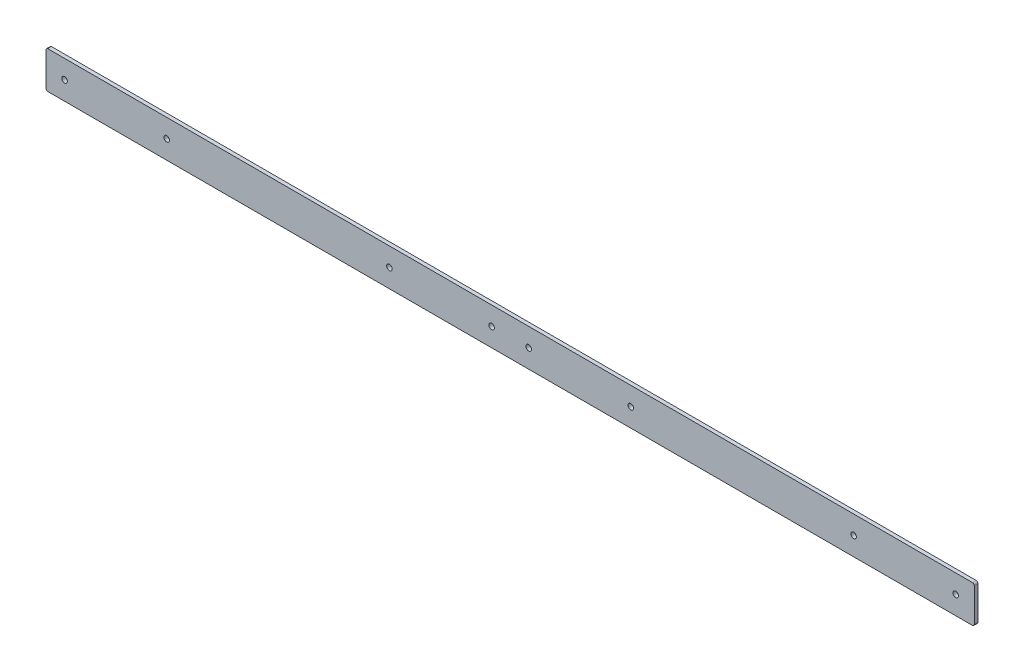
ISO-10303-21;
HEADER;
FILE_DESCRIPTION(('STEP AP214'),'2;1');
FILE_NAME('part.step','',(''),(''),'','','');
FILE_SCHEMA(('AUTOMOTIVE_DESIGN { 1 0 10303 214 1 1 1 1 }'));
ENDSEC;
DATA;
#1=APPLICATION_CONTEXT('core data for automotive mechanical design processes');
#2=APPLICATION_PROTOCOL_DEFINITION('international standard','automotive_design',2000,#1);
#3=PRODUCT_CONTEXT('',#1,'mechanical');
#4=PRODUCT('Part','Part','',(#3));
#5=PRODUCT_RELATED_PRODUCT_CATEGORY('part','',(#4));
#6=PRODUCT_DEFINITION_FORMATION('','',#4);
#7=PRODUCT_DEFINITION_CONTEXT('part definition',#1,'design');
#8=PRODUCT_DEFINITION('design','',#6,#7);
#9=PRODUCT_DEFINITION_SHAPE('','',#8);
#10=(LENGTH_UNIT() NAMED_UNIT(*) SI_UNIT(.MILLI.,.METRE.));
#11=(NAMED_UNIT(*) PLANE_ANGLE_UNIT() SI_UNIT($,.RADIAN.));
#12=(NAMED_UNIT(*) SI_UNIT($,.STERADIAN.) SOLID_ANGLE_UNIT());
#13=UNCERTAINTY_MEASURE_WITH_UNIT(LENGTH_MEASURE(1.E-05),#10,'distance_accuracy_value','');
#14=(GEOMETRIC_REPRESENTATION_CONTEXT(3) GLOBAL_UNCERTAINTY_ASSIGNED_CONTEXT((#13)) GLOBAL_UNIT_ASSIGNED_CONTEXT((#10,
#11,#12)) REPRESENTATION_CONTEXT('',''));
#15=CARTESIAN_POINT('',(0.,0.,0.));
#16=DIRECTION('',(0.,0.,1.));
#17=DIRECTION('',(1.,0.,0.));
#18=AXIS2_PLACEMENT_3D('',#15,#16,#17);
#19=CARTESIAN_POINT('',(0.,0.,2.));
#20=DIRECTION('',(0.,0.,-1.));
#21=DIRECTION('',(-1.,0.,0.));
#22=AXIS2_PLACEMENT_3D('',#19,#20,#21);
#23=PLANE('',#22);
#24=DIRECTION('',(1.,0.,0.));
#25=VECTOR('',#24,1.);
#26=CARTESIAN_POINT('',(-249.999999999999,-9.99999999999997,2.));
#27=LINE('',#26,#25);
#28=CARTESIAN_POINT('',(-248.999999999999,-9.99999999999997,2.));
#29=VERTEX_POINT('',#28);
#30=CARTESIAN_POINT('',(249.000000000001,-9.99999999999991,2.));
#31=VERTEX_POINT('',#30);
#32=EDGE_CURVE('E139',#29,#31,#27,.T.);
#33=ORIENTED_EDGE('',*,*,#32,.T.);
#34=CARTESIAN_POINT('',(249.000000000001,-8.99999999999991,2.));
#35=DIRECTION('',(0.,0.,-1.));
#36=DIRECTION('',(-1.,0.,0.));
#37=AXIS2_PLACEMENT_3D('',#34,#35,#36);
#38=CIRCLE('',#37,1.);
#39=CARTESIAN_POINT('',(250.000000000001,-8.99999999999991,2.));
#40=VERTEX_POINT('',#39);
#41=EDGE_CURVE('E158',#31,#40,#38,.F.);
#42=ORIENTED_EDGE('',*,*,#41,.T.);
#43=DIRECTION('',(0.,1.,0.));
#44=VECTOR('',#43,1.);
#45=CARTESIAN_POINT('',(250.000000000001,-9.99999999999991,2.));
#46=LINE('',#45,#44);
#47=CARTESIAN_POINT('',(250.000000000001,9.00000000000003,2.));
#48=VERTEX_POINT('',#47);
#49=EDGE_CURVE('E122',#40,#48,#46,.T.);
#50=ORIENTED_EDGE('',*,*,#49,.T.);
#51=CARTESIAN_POINT('',(249.000000000001,9.00000000000003,2.));
#52=DIRECTION('',(0.,0.,-1.));
#53=DIRECTION('',(-1.,0.,0.));
#54=AXIS2_PLACEMENT_3D('',#51,#52,#53);
#55=CIRCLE('',#54,1.);
#56=CARTESIAN_POINT('',(249.000000000001,10.,2.));
#57=VERTEX_POINT('',#56);
#58=EDGE_CURVE('E156',#48,#57,#55,.F.);
#59=ORIENTED_EDGE('',*,*,#58,.T.);
#60=DIRECTION('',(-1.,0.,0.));
#61=VECTOR('',#60,1.);
#62=CARTESIAN_POINT('',(-249.999999999999,10.,2.));
#63=LINE('',#62,#61);
#64=CARTESIAN_POINT('',(-248.999999999999,10.,2.));
#65=VERTEX_POINT('',#64);
#66=EDGE_CURVE('E178',#57,#65,#63,.T.);
#67=ORIENTED_EDGE('',*,*,#66,.T.);
#68=CARTESIAN_POINT('',(-248.999999999999,9.00000000000003,2.));
#69=DIRECTION('',(0.,0.,-1.));
#70=DIRECTION('',(-1.,0.,0.));
#71=AXIS2_PLACEMENT_3D('',#68,#69,#70);
#72=CIRCLE('',#71,1.);
#73=CARTESIAN_POINT('',(-249.999999999999,9.00000000000003,2.));
#74=VERTEX_POINT('',#73);
#75=EDGE_CURVE('E57',#65,#74,#72,.F.);
#76=ORIENTED_EDGE('',*,*,#75,.T.);
#77=DIRECTION('',(0.,-1.,0.));
#78=VECTOR('',#77,1.);
#79=CARTESIAN_POINT('',(-249.999999999999,-9.99999999999997,2.));
#80=LINE('',#79,#78);
#81=CARTESIAN_POINT('',(-249.999999999999,-8.99999999999997,2.));
#82=VERTEX_POINT('',#81);
#83=EDGE_CURVE('E168',#74,#82,#80,.T.);
#84=ORIENTED_EDGE('',*,*,#83,.T.);
#85=CARTESIAN_POINT('',(-248.999999999999,-8.99999999999997,2.));
#86=DIRECTION('',(0.,0.,-1.));
#87=DIRECTION('',(-1.,0.,0.));
#88=AXIS2_PLACEMENT_3D('',#85,#86,#87);
#89=CIRCLE('',#88,1.);
#90=EDGE_CURVE('E154',#82,#29,#89,.F.);
#91=ORIENTED_EDGE('',*,*,#90,.T.);
#92=EDGE_LOOP('',(#33,#42,#50,#59,#67,#76,#84,#91));
#93=FACE_BOUND('',#92,.T.);
#94=CARTESIAN_POINT('',(240.000000000001,0.,2.));
#95=DIRECTION('',(0.,0.,1.));
#96=DIRECTION('',(1.,0.,0.));
#97=AXIS2_PLACEMENT_3D('',#94,#95,#96);
#98=CIRCLE('',#97,1.5);
#99=CARTESIAN_POINT('',(241.500000000001,0.,2.));
#100=VERTEX_POINT('',#99);
#101=EDGE_CURVE('E130',#100,#100,#98,.T.);
#102=ORIENTED_EDGE('',*,*,#101,.F.);
#103=EDGE_LOOP('',(#102));
#104=FACE_BOUND('',#103,.T.);
#105=CARTESIAN_POINT('',(185.000000000001,0.,2.));
#106=DIRECTION('',(0.,0.,1.));
#107=DIRECTION('',(1.,0.,0.));
#108=AXIS2_PLACEMENT_3D('',#105,#106,#107);
#109=CIRCLE('',#108,1.5);
#110=CARTESIAN_POINT('',(186.500000000001,0.,2.));
#111=VERTEX_POINT('',#110);
#112=EDGE_CURVE('E183',#111,#111,#109,.T.);
#113=ORIENTED_EDGE('',*,*,#112,.F.);
#114=EDGE_LOOP('',(#113));
#115=FACE_BOUND('',#114,.T.);
#116=CARTESIAN_POINT('',(-239.999999999999,0.,2.));
#117=DIRECTION('',(0.,0.,1.));
#118=DIRECTION('',(1.,0.,0.));
#119=AXIS2_PLACEMENT_3D('',#116,#117,#118);
#120=CIRCLE('',#119,1.5);
#121=CARTESIAN_POINT('',(-238.499999999999,0.,2.));
#122=VERTEX_POINT('',#121);
#123=EDGE_CURVE('E188',#122,#122,#120,.T.);
#124=ORIENTED_EDGE('',*,*,#123,.F.);
#125=EDGE_LOOP('',(#124));
#126=FACE_BOUND('',#125,.T.);
#127=CARTESIAN_POINT('',(-184.999999999999,0.,2.));
#128=DIRECTION('',(0.,0.,1.));
#129=DIRECTION('',(1.,0.,0.));
#130=AXIS2_PLACEMENT_3D('',#127,#128,#129);
#131=CIRCLE('',#130,1.5);
#132=CARTESIAN_POINT('',(-183.499999999999,0.,2.));
#133=VERTEX_POINT('',#132);
#134=EDGE_CURVE('E194',#133,#133,#131,.T.);
#135=ORIENTED_EDGE('',*,*,#134,.F.);
#136=EDGE_LOOP('',(#135));
#137=FACE_BOUND('',#136,.T.);
#138=CARTESIAN_POINT('',(-10.,0.,2.));
#139=DIRECTION('',(0.,0.,1.));
#140=DIRECTION('',(1.,0.,0.));
#141=AXIS2_PLACEMENT_3D('',#138,#139,#140);
#142=CIRCLE('',#141,1.5);
#143=CARTESIAN_POINT('',(-8.5,0.,2.));
#144=VERTEX_POINT('',#143);
#145=EDGE_CURVE('E200',#144,#144,#142,.T.);
#146=ORIENTED_EDGE('',*,*,#145,.F.);
#147=EDGE_LOOP('',(#146));
#148=FACE_BOUND('',#147,.T.);
#149=CARTESIAN_POINT('',(-65.,0.,2.));
#150=DIRECTION('',(0.,0.,1.));
#151=DIRECTION('',(1.,0.,0.));
#152=AXIS2_PLACEMENT_3D('',#149,#150,#151);
#153=CIRCLE('',#152,1.5);
#154=CARTESIAN_POINT('',(-63.5,0.,2.));
#155=VERTEX_POINT('',#154);
#156=EDGE_CURVE('E206',#155,#155,#153,.T.);
#157=ORIENTED_EDGE('',*,*,#156,.F.);
#158=EDGE_LOOP('',(#157));
#159=FACE_BOUND('',#158,.T.);
#160=CARTESIAN_POINT('',(10.,0.,2.));
#161=DIRECTION('',(0.,0.,1.));
#162=DIRECTION('',(-1.,0.,0.));
#163=AXIS2_PLACEMENT_3D('',#160,#161,#162);
#164=CIRCLE('',#163,1.5);
#165=CARTESIAN_POINT('',(8.5,0.,2.));
#166=VERTEX_POINT('',#165);
#167=EDGE_CURVE('E212',#166,#166,#164,.T.);
#168=ORIENTED_EDGE('',*,*,#167,.F.);
#169=EDGE_LOOP('',(#168));
#170=FACE_BOUND('',#169,.T.);
#171=CARTESIAN_POINT('',(65.,0.,2.));
#172=DIRECTION('',(0.,0.,1.));
#173=DIRECTION('',(-1.,0.,0.));
#174=AXIS2_PLACEMENT_3D('',#171,#172,#173);
#175=CIRCLE('',#174,1.5);
#176=CARTESIAN_POINT('',(63.5,0.,2.));
#177=VERTEX_POINT('',#176);
#178=EDGE_CURVE('E218',#177,#177,#175,.T.);
#179=ORIENTED_EDGE('',*,*,#178,.F.);
#180=EDGE_LOOP('',(#179));
#181=FACE_BOUND('',#180,.T.);
#182=ADVANCED_FACE('F37',(#93,#104,#115,#126,#137,#148,#159,#170,#181),#23,.F.);
#183=CARTESIAN_POINT('',(0.,0.,0.));
#184=DIRECTION('',(0.,0.,-1.));
#185=DIRECTION('',(-1.,0.,0.));
#186=AXIS2_PLACEMENT_3D('',#183,#184,#185);
#187=PLANE('',#186);
#188=CARTESIAN_POINT('',(10.,0.,0.));
#189=DIRECTION('',(0.,0.,1.));
#190=DIRECTION('',(-1.,0.,0.));
#191=AXIS2_PLACEMENT_3D('',#188,#189,#190);
#192=CIRCLE('',#191,1.5);
#193=CARTESIAN_POINT('',(8.5,0.,0.));
#194=VERTEX_POINT('',#193);
#195=EDGE_CURVE('E215',#194,#194,#192,.T.);
#196=ORIENTED_EDGE('',*,*,#195,.T.);
#197=EDGE_LOOP('',(#196));
#198=FACE_BOUND('',#197,.T.);
#199=CARTESIAN_POINT('',(-10.,0.,0.));
#200=DIRECTION('',(0.,0.,1.));
#201=DIRECTION('',(1.,0.,0.));
#202=AXIS2_PLACEMENT_3D('',#199,#200,#201);
#203=CIRCLE('',#202,1.5);
#204=CARTESIAN_POINT('',(-8.5,0.,0.));
#205=VERTEX_POINT('',#204);
#206=EDGE_CURVE('E203',#205,#205,#203,.T.);
#207=ORIENTED_EDGE('',*,*,#206,.T.);
#208=EDGE_LOOP('',(#207));
#209=FACE_BOUND('',#208,.T.);
#210=CARTESIAN_POINT('',(-239.999999999999,0.,0.));
#211=DIRECTION('',(0.,0.,1.));
#212=DIRECTION('',(1.,0.,0.));
#213=AXIS2_PLACEMENT_3D('',#210,#211,#212);
#214=CIRCLE('',#213,1.5);
#215=CARTESIAN_POINT('',(-238.499999999999,0.,0.));
#216=VERTEX_POINT('',#215);
#217=EDGE_CURVE('E191',#216,#216,#214,.T.);
#218=ORIENTED_EDGE('',*,*,#217,.T.);
#219=EDGE_LOOP('',(#218));
#220=FACE_BOUND('',#219,.T.);
#221=CARTESIAN_POINT('',(240.000000000001,0.,0.));
#222=DIRECTION('',(0.,0.,1.));
#223=DIRECTION('',(1.,0.,0.));
#224=AXIS2_PLACEMENT_3D('',#221,#222,#223);
#225=CIRCLE('',#224,1.5);
#226=CARTESIAN_POINT('',(241.500000000001,0.,0.));
#227=VERTEX_POINT('',#226);
#228=EDGE_CURVE('E136',#227,#227,#225,.T.);
#229=ORIENTED_EDGE('',*,*,#228,.T.);
#230=EDGE_LOOP('',(#229));
#231=FACE_BOUND('',#230,.T.);
#232=DIRECTION('',(0.,1.,0.));
#233=VECTOR('',#232,1.);
#234=CARTESIAN_POINT('',(250.000000000001,-9.99999999999991,0.));
#235=LINE('',#234,#233);
#236=CARTESIAN_POINT('',(250.000000000001,-8.99999999999991,0.));
#237=VERTEX_POINT('',#236);
#238=CARTESIAN_POINT('',(250.000000000001,9.00000000000003,0.));
#239=VERTEX_POINT('',#238);
#240=EDGE_CURVE('E119',#237,#239,#235,.T.);
#241=ORIENTED_EDGE('',*,*,#240,.F.);
#242=CARTESIAN_POINT('',(249.000000000001,-8.99999999999991,0.));
#243=DIRECTION('',(0.,0.,-1.));
#244=DIRECTION('',(-1.,0.,0.));
#245=AXIS2_PLACEMENT_3D('',#242,#243,#244);
#246=CIRCLE('',#245,1.);
#247=CARTESIAN_POINT('',(249.000000000001,-9.99999999999991,0.));
#248=VERTEX_POINT('',#247);
#249=EDGE_CURVE('E102',#237,#248,#246,.T.);
#250=ORIENTED_EDGE('',*,*,#249,.T.);
#251=DIRECTION('',(1.,0.,0.));
#252=VECTOR('',#251,1.);
#253=CARTESIAN_POINT('',(-249.999999999999,-9.99999999999997,0.));
#254=LINE('',#253,#252);
#255=CARTESIAN_POINT('',(-248.999999999999,-9.99999999999997,0.));
#256=VERTEX_POINT('',#255);
#257=EDGE_CURVE('E143',#256,#248,#254,.T.);
#258=ORIENTED_EDGE('',*,*,#257,.F.);
#259=CARTESIAN_POINT('',(-248.999999999999,-8.99999999999997,0.));
#260=DIRECTION('',(0.,0.,-1.));
#261=DIRECTION('',(-1.,0.,0.));
#262=AXIS2_PLACEMENT_3D('',#259,#260,#261);
#263=CIRCLE('',#262,1.);
#264=CARTESIAN_POINT('',(-249.999999999999,-8.99999999999997,0.));
#265=VERTEX_POINT('',#264);
#266=EDGE_CURVE('E147',#256,#265,#263,.T.);
#267=ORIENTED_EDGE('',*,*,#266,.T.);
#268=DIRECTION('',(0.,-1.,0.));
#269=VECTOR('',#268,1.);
#270=CARTESIAN_POINT('',(-249.999999999999,-9.99999999999997,0.));
#271=LINE('',#270,#269);
#272=CARTESIAN_POINT('',(-249.999999999999,9.00000000000003,0.));
#273=VERTEX_POINT('',#272);
#274=EDGE_CURVE('E133',#273,#265,#271,.T.);
#275=ORIENTED_EDGE('',*,*,#274,.F.);
#276=CARTESIAN_POINT('',(-248.999999999999,9.00000000000003,0.));
#277=DIRECTION('',(0.,0.,-1.));
#278=DIRECTION('',(-1.,0.,0.));
#279=AXIS2_PLACEMENT_3D('',#276,#277,#278);
#280=CIRCLE('',#279,1.);
#281=CARTESIAN_POINT('',(-248.999999999999,10.,0.));
#282=VERTEX_POINT('',#281);
#283=EDGE_CURVE('E123',#273,#282,#280,.T.);
#284=ORIENTED_EDGE('',*,*,#283,.T.);
#285=DIRECTION('',(-1.,0.,0.));
#286=VECTOR('',#285,1.);
#287=CARTESIAN_POINT('',(-249.999999999999,10.,0.));
#288=LINE('',#287,#286);
#289=CARTESIAN_POINT('',(249.000000000001,10.,0.));
#290=VERTEX_POINT('',#289);
#291=EDGE_CURVE('E129',#290,#282,#288,.T.);
#292=ORIENTED_EDGE('',*,*,#291,.F.);
#293=CARTESIAN_POINT('',(249.000000000001,9.00000000000003,0.));
#294=DIRECTION('',(0.,0.,-1.));
#295=DIRECTION('',(-1.,0.,0.));
#296=AXIS2_PLACEMENT_3D('',#293,#294,#295);
#297=CIRCLE('',#296,1.);
#298=EDGE_CURVE('E113',#290,#239,#297,.T.);
#299=ORIENTED_EDGE('',*,*,#298,.T.);
#300=EDGE_LOOP('',(#241,#250,#258,#267,#275,#284,#292,#299));
#301=FACE_BOUND('',#300,.T.);
#302=CARTESIAN_POINT('',(185.000000000001,0.,0.));
#303=DIRECTION('',(0.,0.,1.));
#304=DIRECTION('',(1.,0.,0.));
#305=AXIS2_PLACEMENT_3D('',#302,#303,#304);
#306=CIRCLE('',#305,1.5);
#307=CARTESIAN_POINT('',(186.500000000001,0.,0.));
#308=VERTEX_POINT('',#307);
#309=EDGE_CURVE('E185',#308,#308,#306,.T.);
#310=ORIENTED_EDGE('',*,*,#309,.T.);
#311=EDGE_LOOP('',(#310));
#312=FACE_BOUND('',#311,.T.);
#313=CARTESIAN_POINT('',(-184.999999999999,0.,0.));
#314=DIRECTION('',(0.,0.,1.));
#315=DIRECTION('',(1.,0.,0.));
#316=AXIS2_PLACEMENT_3D('',#313,#314,#315);
#317=CIRCLE('',#316,1.5);
#318=CARTESIAN_POINT('',(-183.499999999999,0.,0.));
#319=VERTEX_POINT('',#318);
#320=EDGE_CURVE('E197',#319,#319,#317,.T.);
#321=ORIENTED_EDGE('',*,*,#320,.T.);
#322=EDGE_LOOP('',(#321));
#323=FACE_BOUND('',#322,.T.);
#324=CARTESIAN_POINT('',(-65.,0.,0.));
#325=DIRECTION('',(0.,0.,1.));
#326=DIRECTION('',(1.,0.,0.));
#327=AXIS2_PLACEMENT_3D('',#324,#325,#326);
#328=CIRCLE('',#327,1.5);
#329=CARTESIAN_POINT('',(-63.5,0.,0.));
#330=VERTEX_POINT('',#329);
#331=EDGE_CURVE('E209',#330,#330,#328,.T.);
#332=ORIENTED_EDGE('',*,*,#331,.T.);
#333=EDGE_LOOP('',(#332));
#334=FACE_BOUND('',#333,.T.);
#335=CARTESIAN_POINT('',(65.,0.,0.));
#336=DIRECTION('',(0.,0.,1.));
#337=DIRECTION('',(-1.,0.,0.));
#338=AXIS2_PLACEMENT_3D('',#335,#336,#337);
#339=CIRCLE('',#338,1.5);
#340=CARTESIAN_POINT('',(63.5,0.,0.));
#341=VERTEX_POINT('',#340);
#342=EDGE_CURVE('E221',#341,#341,#339,.T.);
#343=ORIENTED_EDGE('',*,*,#342,.T.);
#344=EDGE_LOOP('',(#343));
#345=FACE_BOUND('',#344,.T.);
#346=ADVANCED_FACE('F126',(#198,#209,#220,#231,#301,#312,#323,#334,#345),#187,.T.);
#347=CARTESIAN_POINT('',(250.000000000001,-9.99999999999991,2.));
#348=DIRECTION('',(-1.,0.,0.));
#349=DIRECTION('',(0.,0.,1.));
#350=AXIS2_PLACEMENT_3D('',#347,#348,#349);
#351=PLANE('',#350);
#352=ORIENTED_EDGE('',*,*,#49,.F.);
#353=DIRECTION('',(0.,0.,-1.));
#354=VECTOR('',#353,1.);
#355=CARTESIAN_POINT('',(250.000000000001,-8.99999999999991,2.));
#356=LINE('',#355,#354);
#357=EDGE_CURVE('E106',#40,#237,#356,.T.);
#358=ORIENTED_EDGE('',*,*,#357,.T.);
#359=ORIENTED_EDGE('',*,*,#240,.T.);
#360=DIRECTION('',(0.,0.,-1.));
#361=VECTOR('',#360,1.);
#362=CARTESIAN_POINT('',(250.000000000001,9.00000000000003,2.));
#363=LINE('',#362,#361);
#364=EDGE_CURVE('E124',#239,#48,#363,.F.);
#365=ORIENTED_EDGE('',*,*,#364,.T.);
#366=EDGE_LOOP('',(#352,#358,#359,#365));
#367=FACE_BOUND('',#366,.T.);
#368=ADVANCED_FACE('F118',(#367),#351,.F.);
#369=CARTESIAN_POINT('',(-249.999999999999,10.,2.));
#370=DIRECTION('',(0.,-1.,0.));
#371=DIRECTION('',(1.,0.,0.));
#372=AXIS2_PLACEMENT_3D('',#369,#370,#371);
#373=PLANE('',#372);
#374=ORIENTED_EDGE('',*,*,#66,.F.);
#375=DIRECTION('',(0.,0.,-1.));
#376=VECTOR('',#375,1.);
#377=CARTESIAN_POINT('',(249.000000000001,10.,2.));
#378=LINE('',#377,#376);
#379=EDGE_CURVE('E162',#57,#290,#378,.T.);
#380=ORIENTED_EDGE('',*,*,#379,.T.);
#381=ORIENTED_EDGE('',*,*,#291,.T.);
#382=DIRECTION('',(0.,0.,-1.));
#383=VECTOR('',#382,1.);
#384=CARTESIAN_POINT('',(-248.999999999999,10.,2.));
#385=LINE('',#384,#383);
#386=EDGE_CURVE('E160',#282,#65,#385,.F.);
#387=ORIENTED_EDGE('',*,*,#386,.T.);
#388=EDGE_LOOP('',(#374,#380,#381,#387));
#389=FACE_BOUND('',#388,.T.);
#390=ADVANCED_FACE('F246',(#389),#373,.F.);
#391=CARTESIAN_POINT('',(-249.999999999999,-9.99999999999997,2.));
#392=DIRECTION('',(1.,0.,0.));
#393=DIRECTION('',(0.,0.,-1.));
#394=AXIS2_PLACEMENT_3D('',#391,#392,#393);
#395=PLANE('',#394);
#396=ORIENTED_EDGE('',*,*,#274,.T.);
#397=DIRECTION('',(0.,0.,-1.));
#398=VECTOR('',#397,1.);
#399=CARTESIAN_POINT('',(-249.999999999999,-8.99999999999997,2.));
#400=LINE('',#399,#398);
#401=EDGE_CURVE('E11',#265,#82,#400,.F.);
#402=ORIENTED_EDGE('',*,*,#401,.T.);
#403=ORIENTED_EDGE('',*,*,#83,.F.);
#404=DIRECTION('',(0.,0.,-1.));
#405=VECTOR('',#404,1.);
#406=CARTESIAN_POINT('',(-249.999999999999,9.00000000000003,2.));
#407=LINE('',#406,#405);
#408=EDGE_CURVE('E45',#74,#273,#407,.T.);
#409=ORIENTED_EDGE('',*,*,#408,.T.);
#410=EDGE_LOOP('',(#396,#402,#403,#409));
#411=FACE_BOUND('',#410,.T.);
#412=ADVANCED_FACE('F167',(#411),#395,.F.);
#413=CARTESIAN_POINT('',(-249.999999999999,-9.99999999999997,2.));
#414=DIRECTION('',(0.,1.,0.));
#415=DIRECTION('',(-1.,0.,0.));
#416=AXIS2_PLACEMENT_3D('',#413,#414,#415);
#417=PLANE('',#416);
#418=ORIENTED_EDGE('',*,*,#257,.T.);
#419=DIRECTION('',(0.,0.,-1.));
#420=VECTOR('',#419,1.);
#421=CARTESIAN_POINT('',(249.000000000001,-9.99999999999991,2.));
#422=LINE('',#421,#420);
#423=EDGE_CURVE('E107',#248,#31,#422,.F.);
#424=ORIENTED_EDGE('',*,*,#423,.T.);
#425=ORIENTED_EDGE('',*,*,#32,.F.);
#426=DIRECTION('',(0.,0.,-1.));
#427=VECTOR('',#426,1.);
#428=CARTESIAN_POINT('',(-248.999999999999,-9.99999999999997,2.));
#429=LINE('',#428,#427);
#430=EDGE_CURVE('E112',#29,#256,#429,.T.);
#431=ORIENTED_EDGE('',*,*,#430,.T.);
#432=EDGE_LOOP('',(#418,#424,#425,#431));
#433=FACE_BOUND('',#432,.T.);
#434=ADVANCED_FACE('F176',(#433),#417,.F.);
#435=CARTESIAN_POINT('',(240.000000000001,0.,2.));
#436=DIRECTION('',(0.,0.,-1.));
#437=DIRECTION('',(-1.,0.,0.));
#438=AXIS2_PLACEMENT_3D('',#435,#436,#437);
#439=CYLINDRICAL_SURFACE('',#438,1.5);
#440=ORIENTED_EDGE('',*,*,#101,.T.);
#441=EDGE_LOOP('',(#440));
#442=FACE_BOUND('',#441,.T.);
#443=ORIENTED_EDGE('',*,*,#228,.F.);
#444=EDGE_LOOP('',(#443));
#445=FACE_BOUND('',#444,.T.);
#446=ADVANCED_FACE('F239',(#442,#445),#439,.F.);
#447=CARTESIAN_POINT('',(185.000000000001,0.,2.));
#448=DIRECTION('',(0.,0.,-1.));
#449=DIRECTION('',(-1.,0.,0.));
#450=AXIS2_PLACEMENT_3D('',#447,#448,#449);
#451=CYLINDRICAL_SURFACE('',#450,1.5);
#452=ORIENTED_EDGE('',*,*,#112,.T.);
#453=EDGE_LOOP('',(#452));
#454=FACE_BOUND('',#453,.T.);
#455=ORIENTED_EDGE('',*,*,#309,.F.);
#456=EDGE_LOOP('',(#455));
#457=FACE_BOUND('',#456,.T.);
#458=ADVANCED_FACE('F392',(#454,#457),#451,.F.);
#459=CARTESIAN_POINT('',(-239.999999999999,0.,2.));
#460=DIRECTION('',(0.,0.,-1.));
#461=DIRECTION('',(-1.,0.,0.));
#462=AXIS2_PLACEMENT_3D('',#459,#460,#461);
#463=CYLINDRICAL_SURFACE('',#462,1.5);
#464=ORIENTED_EDGE('',*,*,#123,.T.);
#465=EDGE_LOOP('',(#464));
#466=FACE_BOUND('',#465,.T.);
#467=ORIENTED_EDGE('',*,*,#217,.F.);
#468=EDGE_LOOP('',(#467));
#469=FACE_BOUND('',#468,.T.);
#470=ADVANCED_FACE('F381',(#466,#469),#463,.F.);
#471=CARTESIAN_POINT('',(-184.999999999999,0.,2.));
#472=DIRECTION('',(0.,0.,-1.));
#473=DIRECTION('',(-1.,0.,0.));
#474=AXIS2_PLACEMENT_3D('',#471,#472,#473);
#475=CYLINDRICAL_SURFACE('',#474,1.5);
#476=ORIENTED_EDGE('',*,*,#134,.T.);
#477=EDGE_LOOP('',(#476));
#478=FACE_BOUND('',#477,.T.);
#479=ORIENTED_EDGE('',*,*,#320,.F.);
#480=EDGE_LOOP('',(#479));
#481=FACE_BOUND('',#480,.T.);
#482=ADVANCED_FACE('F370',(#478,#481),#475,.F.);
#483=CARTESIAN_POINT('',(-10.,0.,2.));
#484=DIRECTION('',(0.,0.,-1.));
#485=DIRECTION('',(-1.,0.,0.));
#486=AXIS2_PLACEMENT_3D('',#483,#484,#485);
#487=CYLINDRICAL_SURFACE('',#486,1.5);
#488=ORIENTED_EDGE('',*,*,#145,.T.);
#489=EDGE_LOOP('',(#488));
#490=FACE_BOUND('',#489,.T.);
#491=ORIENTED_EDGE('',*,*,#206,.F.);
#492=EDGE_LOOP('',(#491));
#493=FACE_BOUND('',#492,.T.);
#494=ADVANCED_FACE('F359',(#490,#493),#487,.F.);
#495=CARTESIAN_POINT('',(-65.,0.,2.));
#496=DIRECTION('',(0.,0.,-1.));
#497=DIRECTION('',(-1.,0.,0.));
#498=AXIS2_PLACEMENT_3D('',#495,#496,#497);
#499=CYLINDRICAL_SURFACE('',#498,1.5);
#500=ORIENTED_EDGE('',*,*,#156,.T.);
#501=EDGE_LOOP('',(#500));
#502=FACE_BOUND('',#501,.T.);
#503=ORIENTED_EDGE('',*,*,#331,.F.);
#504=EDGE_LOOP('',(#503));
#505=FACE_BOUND('',#504,.T.);
#506=ADVANCED_FACE('F348',(#502,#505),#499,.F.);
#507=CARTESIAN_POINT('',(10.,0.,2.));
#508=DIRECTION('',(0.,0.,-1.));
#509=DIRECTION('',(-1.,0.,0.));
#510=AXIS2_PLACEMENT_3D('',#507,#508,#509);
#511=CYLINDRICAL_SURFACE('',#510,1.5);
#512=ORIENTED_EDGE('',*,*,#167,.T.);
#513=EDGE_LOOP('',(#512));
#514=FACE_BOUND('',#513,.T.);
#515=ORIENTED_EDGE('',*,*,#195,.F.);
#516=EDGE_LOOP('',(#515));
#517=FACE_BOUND('',#516,.T.);
#518=ADVANCED_FACE('F338',(#514,#517),#511,.F.);
#519=CARTESIAN_POINT('',(65.,0.,2.));
#520=DIRECTION('',(0.,0.,-1.));
#521=DIRECTION('',(-1.,0.,0.));
#522=AXIS2_PLACEMENT_3D('',#519,#520,#521);
#523=CYLINDRICAL_SURFACE('',#522,1.5);
#524=ORIENTED_EDGE('',*,*,#178,.T.);
#525=EDGE_LOOP('',(#524));
#526=FACE_BOUND('',#525,.T.);
#527=ORIENTED_EDGE('',*,*,#342,.F.);
#528=EDGE_LOOP('',(#527));
#529=FACE_BOUND('',#528,.T.);
#530=ADVANCED_FACE('F227',(#526,#529),#523,.F.);
#531=CARTESIAN_POINT('',(249.000000000001,-8.99999999999991,2.));
#532=DIRECTION('',(0.,0.,-1.));
#533=DIRECTION('',(-1.,0.,0.));
#534=AXIS2_PLACEMENT_3D('',#531,#532,#533);
#535=CYLINDRICAL_SURFACE('',#534,1.);
#536=ORIENTED_EDGE('',*,*,#41,.F.);
#537=ORIENTED_EDGE('',*,*,#423,.F.);
#538=ORIENTED_EDGE('',*,*,#249,.F.);
#539=ORIENTED_EDGE('',*,*,#357,.F.);
#540=EDGE_LOOP('',(#536,#537,#538,#539));
#541=FACE_BOUND('',#540,.T.);
#542=ADVANCED_FACE('F105',(#541),#535,.T.);
#543=CARTESIAN_POINT('',(249.000000000001,9.00000000000003,2.));
#544=DIRECTION('',(0.,0.,-1.));
#545=DIRECTION('',(-1.,0.,0.));
#546=AXIS2_PLACEMENT_3D('',#543,#544,#545);
#547=CYLINDRICAL_SURFACE('',#546,1.);
#548=ORIENTED_EDGE('',*,*,#58,.F.);
#549=ORIENTED_EDGE('',*,*,#364,.F.);
#550=ORIENTED_EDGE('',*,*,#298,.F.);
#551=ORIENTED_EDGE('',*,*,#379,.F.);
#552=EDGE_LOOP('',(#548,#549,#550,#551));
#553=FACE_BOUND('',#552,.T.);
#554=ADVANCED_FACE('F254',(#553),#547,.T.);
#555=CARTESIAN_POINT('',(-248.999999999999,-8.99999999999997,2.));
#556=DIRECTION('',(0.,0.,-1.));
#557=DIRECTION('',(-1.,0.,0.));
#558=AXIS2_PLACEMENT_3D('',#555,#556,#557);
#559=CYLINDRICAL_SURFACE('',#558,1.);
#560=ORIENTED_EDGE('',*,*,#90,.F.);
#561=ORIENTED_EDGE('',*,*,#401,.F.);
#562=ORIENTED_EDGE('',*,*,#266,.F.);
#563=ORIENTED_EDGE('',*,*,#430,.F.);
#564=EDGE_LOOP('',(#560,#561,#562,#563));
#565=FACE_BOUND('',#564,.T.);
#566=ADVANCED_FACE('F173',(#565),#559,.T.);
#567=CARTESIAN_POINT('',(-248.999999999999,9.00000000000003,2.));
#568=DIRECTION('',(0.,0.,-1.));
#569=DIRECTION('',(-1.,0.,0.));
#570=AXIS2_PLACEMENT_3D('',#567,#568,#569);
#571=CYLINDRICAL_SURFACE('',#570,1.);
#572=ORIENTED_EDGE('',*,*,#75,.F.);
#573=ORIENTED_EDGE('',*,*,#386,.F.);
#574=ORIENTED_EDGE('',*,*,#283,.F.);
#575=ORIENTED_EDGE('',*,*,#408,.F.);
#576=EDGE_LOOP('',(#572,#573,#574,#575));
#577=FACE_BOUND('',#576,.T.);
#578=ADVANCED_FACE('F39',(#577),#571,.T.);
#579=CLOSED_SHELL('',(#182,#346,#368,#390,#412,#434,#446,#458,#470,#482,#494,#506,#518,#530,
#542,#554,#566,#578));
#580=MANIFOLD_SOLID_BREP('B2',#579);
#581=ADVANCED_BREP_SHAPE_REPRESENTATION('',(#18,#580),#14);
#582=SHAPE_DEFINITION_REPRESENTATION(#9,#581);
ENDSEC;
END-ISO-10303-21;
